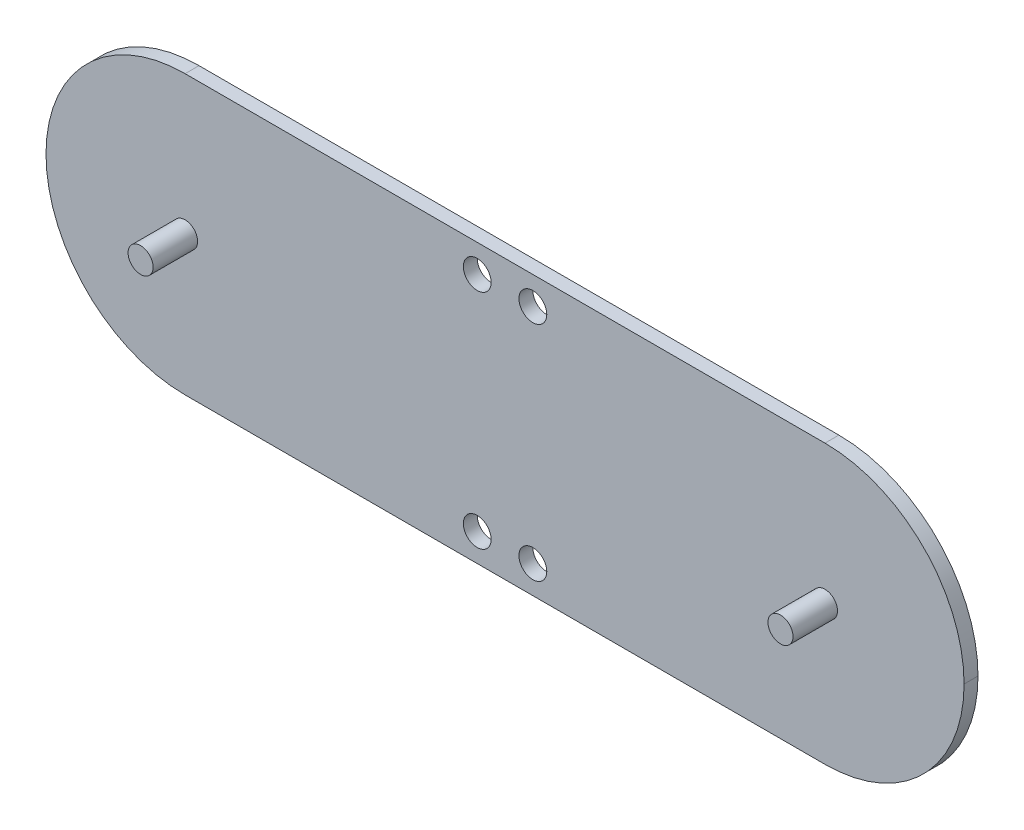
ISO-10303-21;
HEADER;
FILE_DESCRIPTION(('STEP AP214'),'2;1');
FILE_NAME('part.step','',(''),(''),'','','');
FILE_SCHEMA(('AUTOMOTIVE_DESIGN { 1 0 10303 214 1 1 1 1 }'));
ENDSEC;
DATA;
#1=APPLICATION_CONTEXT('core data for automotive mechanical design processes');
#2=APPLICATION_PROTOCOL_DEFINITION('international standard','automotive_design',2000,#1);
#3=PRODUCT_CONTEXT('',#1,'mechanical');
#4=PRODUCT('Part','Part','',(#3));
#5=PRODUCT_RELATED_PRODUCT_CATEGORY('part','',(#4));
#6=PRODUCT_DEFINITION_FORMATION('','',#4);
#7=PRODUCT_DEFINITION_CONTEXT('part definition',#1,'design');
#8=PRODUCT_DEFINITION('design','',#6,#7);
#9=PRODUCT_DEFINITION_SHAPE('','',#8);
#10=(LENGTH_UNIT() NAMED_UNIT(*) SI_UNIT(.MILLI.,.METRE.));
#11=(NAMED_UNIT(*) PLANE_ANGLE_UNIT() SI_UNIT($,.RADIAN.));
#12=(NAMED_UNIT(*) SI_UNIT($,.STERADIAN.) SOLID_ANGLE_UNIT());
#13=UNCERTAINTY_MEASURE_WITH_UNIT(LENGTH_MEASURE(1.E-05),#10,'distance_accuracy_value','');
#14=(GEOMETRIC_REPRESENTATION_CONTEXT(3) GLOBAL_UNCERTAINTY_ASSIGNED_CONTEXT((#13)) GLOBAL_UNIT_ASSIGNED_CONTEXT((#10,
#11,#12)) REPRESENTATION_CONTEXT('',''));
#15=CARTESIAN_POINT('',(0.,0.,0.));
#16=DIRECTION('',(0.,0.,1.));
#17=DIRECTION('',(1.,0.,0.));
#18=AXIS2_PLACEMENT_3D('',#15,#16,#17);
#19=CARTESIAN_POINT('',(82.5,-25.,2.5));
#20=DIRECTION('',(0.,1.,0.));
#21=DIRECTION('',(-1.,0.,0.));
#22=AXIS2_PLACEMENT_3D('',#19,#20,#21);
#23=PLANE('',#22);
#24=DIRECTION('',(1.,0.,0.));
#25=VECTOR('',#24,1.);
#26=CARTESIAN_POINT('',(82.5,-25.,2.5));
#27=LINE('',#26,#25);
#28=CARTESIAN_POINT('',(-57.5,-25.,2.5));
#29=VERTEX_POINT('',#28);
#30=CARTESIAN_POINT('',(57.5,-25.,2.5));
#31=VERTEX_POINT('',#30);
#32=EDGE_CURVE('E117',#29,#31,#27,.T.);
#33=ORIENTED_EDGE('',*,*,#32,.F.);
#34=DIRECTION('',(0.,0.,-1.));
#35=VECTOR('',#34,1.);
#36=CARTESIAN_POINT('',(-57.5,-25.,2.5));
#37=LINE('',#36,#35);
#38=CARTESIAN_POINT('',(-57.5,-25.,0.));
#39=VERTEX_POINT('',#38);
#40=EDGE_CURVE('E101',#29,#39,#37,.T.);
#41=ORIENTED_EDGE('',*,*,#40,.T.);
#42=DIRECTION('',(1.,0.,0.));
#43=VECTOR('',#42,1.);
#44=CARTESIAN_POINT('',(82.5,-25.,0.));
#45=LINE('',#44,#43);
#46=CARTESIAN_POINT('',(57.5,-25.,0.));
#47=VERTEX_POINT('',#46);
#48=EDGE_CURVE('E114',#39,#47,#45,.T.);
#49=ORIENTED_EDGE('',*,*,#48,.T.);
#50=DIRECTION('',(0.,0.,-1.));
#51=VECTOR('',#50,1.);
#52=CARTESIAN_POINT('',(57.5,-25.,2.5));
#53=LINE('',#52,#51);
#54=EDGE_CURVE('E120',#47,#31,#53,.F.);
#55=ORIENTED_EDGE('',*,*,#54,.T.);
#56=EDGE_LOOP('',(#33,#41,#49,#55));
#57=FACE_BOUND('',#56,.T.);
#58=ADVANCED_FACE('F43',(#57),#23,.F.);
#59=CARTESIAN_POINT('',(82.5,25.,2.5));
#60=DIRECTION('',(0.,-1.,0.));
#61=DIRECTION('',(1.,0.,0.));
#62=AXIS2_PLACEMENT_3D('',#59,#60,#61);
#63=PLANE('',#62);
#64=DIRECTION('',(-1.,0.,0.));
#65=VECTOR('',#64,1.);
#66=CARTESIAN_POINT('',(82.5,25.,0.));
#67=LINE('',#66,#65);
#68=CARTESIAN_POINT('',(57.5,25.,0.));
#69=VERTEX_POINT('',#68);
#70=CARTESIAN_POINT('',(-57.5,25.,0.));
#71=VERTEX_POINT('',#70);
#72=EDGE_CURVE('E126',#69,#71,#67,.T.);
#73=ORIENTED_EDGE('',*,*,#72,.T.);
#74=DIRECTION('',(0.,0.,-1.));
#75=VECTOR('',#74,1.);
#76=CARTESIAN_POINT('',(-57.5,25.,2.5));
#77=LINE('',#76,#75);
#78=CARTESIAN_POINT('',(-57.5,25.,2.5));
#79=VERTEX_POINT('',#78);
#80=EDGE_CURVE('E52',#71,#79,#77,.F.);
#81=ORIENTED_EDGE('',*,*,#80,.T.);
#82=DIRECTION('',(-1.,0.,0.));
#83=VECTOR('',#82,1.);
#84=CARTESIAN_POINT('',(82.5,25.,2.5));
#85=LINE('',#84,#83);
#86=CARTESIAN_POINT('',(57.5,25.,2.5));
#87=VERTEX_POINT('',#86);
#88=EDGE_CURVE('E134',#87,#79,#85,.T.);
#89=ORIENTED_EDGE('',*,*,#88,.F.);
#90=DIRECTION('',(0.,0.,-1.));
#91=VECTOR('',#90,1.);
#92=CARTESIAN_POINT('',(57.5,25.,2.5));
#93=LINE('',#92,#91);
#94=EDGE_CURVE('E156',#87,#69,#93,.T.);
#95=ORIENTED_EDGE('',*,*,#94,.T.);
#96=EDGE_LOOP('',(#73,#81,#89,#95));
#97=FACE_BOUND('',#96,.T.);
#98=ADVANCED_FACE('F195',(#97),#63,.F.);
#99=CARTESIAN_POINT('',(0.,0.,2.5));
#100=DIRECTION('',(0.,0.,-1.));
#101=DIRECTION('',(-1.,0.,0.));
#102=AXIS2_PLACEMENT_3D('',#99,#100,#101);
#103=PLANE('',#102);
#104=CARTESIAN_POINT('',(57.5,0.,2.5));
#105=DIRECTION('',(0.,0.,-1.));
#106=DIRECTION('',(-1.,0.,0.));
#107=AXIS2_PLACEMENT_3D('',#104,#105,#106);
#108=CIRCLE('',#107,2.25);
#109=CARTESIAN_POINT('',(55.25,0.,2.5));
#110=VERTEX_POINT('',#109);
#111=EDGE_CURVE('E263',#110,#110,#108,.T.);
#112=ORIENTED_EDGE('',*,*,#111,.T.);
#113=EDGE_LOOP('',(#112));
#114=FACE_BOUND('',#113,.T.);
#115=CARTESIAN_POINT('',(-57.5,0.,2.5));
#116=DIRECTION('',(0.,0.,-1.));
#117=DIRECTION('',(-1.,0.,0.));
#118=AXIS2_PLACEMENT_3D('',#115,#116,#117);
#119=CIRCLE('',#118,2.25);
#120=CARTESIAN_POINT('',(-59.75,0.,2.5));
#121=VERTEX_POINT('',#120);
#122=EDGE_CURVE('E12',#121,#121,#119,.F.);
#123=ORIENTED_EDGE('',*,*,#122,.F.);
#124=EDGE_LOOP('',(#123));
#125=FACE_BOUND('',#124,.T.);
#126=CARTESIAN_POINT('',(-5.,-20.,2.5));
#127=DIRECTION('',(0.,0.,-1.));
#128=DIRECTION('',(1.,0.,0.));
#129=AXIS2_PLACEMENT_3D('',#126,#127,#128);
#130=CIRCLE('',#129,2.5);
#131=CARTESIAN_POINT('',(-2.5,-20.,2.5));
#132=VERTEX_POINT('',#131);
#133=EDGE_CURVE('E275',#132,#132,#130,.T.);
#134=ORIENTED_EDGE('',*,*,#133,.T.);
#135=EDGE_LOOP('',(#134));
#136=FACE_BOUND('',#135,.T.);
#137=CARTESIAN_POINT('',(5.,-20.,2.5));
#138=DIRECTION('',(0.,0.,-1.));
#139=DIRECTION('',(1.,0.,0.));
#140=AXIS2_PLACEMENT_3D('',#137,#138,#139);
#141=CIRCLE('',#140,2.5);
#142=CARTESIAN_POINT('',(7.5,-20.,2.5));
#143=VERTEX_POINT('',#142);
#144=EDGE_CURVE('E176',#143,#143,#141,.T.);
#145=ORIENTED_EDGE('',*,*,#144,.T.);
#146=EDGE_LOOP('',(#145));
#147=FACE_BOUND('',#146,.T.);
#148=CARTESIAN_POINT('',(-5.,20.,2.5));
#149=DIRECTION('',(0.,0.,1.));
#150=DIRECTION('',(1.,0.,0.));
#151=AXIS2_PLACEMENT_3D('',#148,#149,#150);
#152=CIRCLE('',#151,2.5);
#153=CARTESIAN_POINT('',(-2.5,20.,2.5));
#154=VERTEX_POINT('',#153);
#155=EDGE_CURVE('E167',#154,#154,#152,.T.);
#156=ORIENTED_EDGE('',*,*,#155,.F.);
#157=EDGE_LOOP('',(#156));
#158=FACE_BOUND('',#157,.T.);
#159=CARTESIAN_POINT('',(5.,20.,2.5));
#160=DIRECTION('',(0.,0.,1.));
#161=DIRECTION('',(1.,0.,0.));
#162=AXIS2_PLACEMENT_3D('',#159,#160,#161);
#163=CIRCLE('',#162,2.5);
#164=CARTESIAN_POINT('',(7.5,20.,2.5));
#165=VERTEX_POINT('',#164);
#166=EDGE_CURVE('E182',#165,#165,#163,.T.);
#167=ORIENTED_EDGE('',*,*,#166,.F.);
#168=EDGE_LOOP('',(#167));
#169=FACE_BOUND('',#168,.T.);
#170=CARTESIAN_POINT('',(-57.5,0.,2.5));
#171=DIRECTION('',(0.,0.,-1.));
#172=DIRECTION('',(-1.,0.,0.));
#173=AXIS2_PLACEMENT_3D('',#170,#171,#172);
#174=CIRCLE('',#173,25.);
#175=CARTESIAN_POINT('',(-82.5,0.,2.5));
#176=VERTEX_POINT('',#175);
#177=EDGE_CURVE('E150',#79,#176,#174,.F.);
#178=ORIENTED_EDGE('',*,*,#177,.T.);
#179=CARTESIAN_POINT('',(-57.5,0.,2.5));
#180=DIRECTION('',(0.,0.,-1.));
#181=DIRECTION('',(-1.,0.,0.));
#182=AXIS2_PLACEMENT_3D('',#179,#180,#181);
#183=CIRCLE('',#182,25.);
#184=EDGE_CURVE('E153',#176,#29,#183,.F.);
#185=ORIENTED_EDGE('',*,*,#184,.T.);
#186=ORIENTED_EDGE('',*,*,#32,.T.);
#187=CARTESIAN_POINT('',(57.5,0.,2.5));
#188=DIRECTION('',(0.,0.,-1.));
#189=DIRECTION('',(-1.,0.,0.));
#190=AXIS2_PLACEMENT_3D('',#187,#188,#189);
#191=CIRCLE('',#190,25.);
#192=CARTESIAN_POINT('',(82.5,0.,2.5));
#193=VERTEX_POINT('',#192);
#194=EDGE_CURVE('E147',#31,#193,#191,.F.);
#195=ORIENTED_EDGE('',*,*,#194,.T.);
#196=CARTESIAN_POINT('',(57.5,0.,2.5));
#197=DIRECTION('',(0.,0.,-1.));
#198=DIRECTION('',(-1.,0.,0.));
#199=AXIS2_PLACEMENT_3D('',#196,#197,#198);
#200=CIRCLE('',#199,25.);
#201=EDGE_CURVE('E65',#193,#87,#200,.F.);
#202=ORIENTED_EDGE('',*,*,#201,.T.);
#203=ORIENTED_EDGE('',*,*,#88,.T.);
#204=EDGE_LOOP('',(#178,#185,#186,#195,#202,#203));
#205=FACE_BOUND('',#204,.T.);
#206=ADVANCED_FACE('F189',(#114,#125,#136,#147,#158,#169,#205),#103,.F.);
#207=CARTESIAN_POINT('',(0.,0.,0.));
#208=DIRECTION('',(0.,0.,-1.));
#209=DIRECTION('',(-1.,0.,0.));
#210=AXIS2_PLACEMENT_3D('',#207,#208,#209);
#211=PLANE('',#210);
#212=CARTESIAN_POINT('',(-5.,-20.,0.));
#213=DIRECTION('',(0.,0.,-1.));
#214=DIRECTION('',(1.,0.,0.));
#215=AXIS2_PLACEMENT_3D('',#212,#213,#214);
#216=CIRCLE('',#215,2.5);
#217=CARTESIAN_POINT('',(-2.5,-20.,0.));
#218=VERTEX_POINT('',#217);
#219=EDGE_CURVE('E185',#218,#218,#216,.T.);
#220=ORIENTED_EDGE('',*,*,#219,.F.);
#221=EDGE_LOOP('',(#220));
#222=FACE_BOUND('',#221,.T.);
#223=CARTESIAN_POINT('',(5.,-20.,0.));
#224=DIRECTION('',(0.,0.,-1.));
#225=DIRECTION('',(1.,0.,0.));
#226=AXIS2_PLACEMENT_3D('',#223,#224,#225);
#227=CIRCLE('',#226,2.5);
#228=CARTESIAN_POINT('',(7.5,-20.,0.));
#229=VERTEX_POINT('',#228);
#230=EDGE_CURVE('E278',#229,#229,#227,.T.);
#231=ORIENTED_EDGE('',*,*,#230,.F.);
#232=EDGE_LOOP('',(#231));
#233=FACE_BOUND('',#232,.T.);
#234=CARTESIAN_POINT('',(-5.,20.,0.));
#235=DIRECTION('',(0.,0.,1.));
#236=DIRECTION('',(1.,0.,0.));
#237=AXIS2_PLACEMENT_3D('',#234,#235,#236);
#238=CIRCLE('',#237,2.5);
#239=CARTESIAN_POINT('',(-2.5,20.,0.));
#240=VERTEX_POINT('',#239);
#241=EDGE_CURVE('E162',#240,#240,#238,.T.);
#242=ORIENTED_EDGE('',*,*,#241,.T.);
#243=EDGE_LOOP('',(#242));
#244=FACE_BOUND('',#243,.T.);
#245=CARTESIAN_POINT('',(5.,20.,0.));
#246=DIRECTION('',(0.,0.,1.));
#247=DIRECTION('',(1.,0.,0.));
#248=AXIS2_PLACEMENT_3D('',#245,#246,#247);
#249=CIRCLE('',#248,2.5);
#250=CARTESIAN_POINT('',(7.5,20.,0.));
#251=VERTEX_POINT('',#250);
#252=EDGE_CURVE('E173',#251,#251,#249,.T.);
#253=ORIENTED_EDGE('',*,*,#252,.T.);
#254=EDGE_LOOP('',(#253));
#255=FACE_BOUND('',#254,.T.);
#256=ORIENTED_EDGE('',*,*,#48,.F.);
#257=CARTESIAN_POINT('',(-57.5,0.,0.));
#258=DIRECTION('',(0.,0.,-1.));
#259=DIRECTION('',(-1.,0.,0.));
#260=AXIS2_PLACEMENT_3D('',#257,#258,#259);
#261=CIRCLE('',#260,25.);
#262=CARTESIAN_POINT('',(-82.5,0.,0.));
#263=VERTEX_POINT('',#262);
#264=EDGE_CURVE('E97',#39,#263,#261,.T.);
#265=ORIENTED_EDGE('',*,*,#264,.T.);
#266=CARTESIAN_POINT('',(-57.5,0.,0.));
#267=DIRECTION('',(0.,0.,-1.));
#268=DIRECTION('',(-1.,0.,0.));
#269=AXIS2_PLACEMENT_3D('',#266,#267,#268);
#270=CIRCLE('',#269,25.);
#271=EDGE_CURVE('E108',#263,#71,#270,.T.);
#272=ORIENTED_EDGE('',*,*,#271,.T.);
#273=ORIENTED_EDGE('',*,*,#72,.F.);
#274=CARTESIAN_POINT('',(57.5,0.,0.));
#275=DIRECTION('',(0.,0.,-1.));
#276=DIRECTION('',(-1.,0.,0.));
#277=AXIS2_PLACEMENT_3D('',#274,#275,#276);
#278=CIRCLE('',#277,25.);
#279=CARTESIAN_POINT('',(82.5,0.,0.));
#280=VERTEX_POINT('',#279);
#281=EDGE_CURVE('E119',#69,#280,#278,.T.);
#282=ORIENTED_EDGE('',*,*,#281,.T.);
#283=CARTESIAN_POINT('',(57.5,0.,0.));
#284=DIRECTION('',(0.,0.,-1.));
#285=DIRECTION('',(-1.,0.,0.));
#286=AXIS2_PLACEMENT_3D('',#283,#284,#285);
#287=CIRCLE('',#286,25.);
#288=EDGE_CURVE('E124',#280,#47,#287,.T.);
#289=ORIENTED_EDGE('',*,*,#288,.T.);
#290=EDGE_LOOP('',(#256,#265,#272,#273,#282,#289));
#291=FACE_BOUND('',#290,.T.);
#292=ADVANCED_FACE('F122',(#222,#233,#244,#255,#291),#211,.T.);
#293=CARTESIAN_POINT('',(-57.5,0.,2.5));
#294=DIRECTION('',(0.,0.,-1.));
#295=DIRECTION('',(-1.,0.,0.));
#296=AXIS2_PLACEMENT_3D('',#293,#294,#295);
#297=CYLINDRICAL_SURFACE('',#296,25.);
#298=DIRECTION('',(0.,0.,-1.));
#299=VECTOR('',#298,1.);
#300=CARTESIAN_POINT('',(-82.5,0.,2.5));
#301=LINE('',#300,#299);
#302=EDGE_CURVE('E103',#176,#263,#301,.T.);
#303=ORIENTED_EDGE('',*,*,#302,.F.);
#304=ORIENTED_EDGE('',*,*,#177,.F.);
#305=ORIENTED_EDGE('',*,*,#80,.F.);
#306=ORIENTED_EDGE('',*,*,#271,.F.);
#307=EDGE_LOOP('',(#303,#304,#305,#306));
#308=FACE_BOUND('',#307,.T.);
#309=ADVANCED_FACE('F192',(#308),#297,.T.);
#310=CARTESIAN_POINT('',(-57.5,0.,2.5));
#311=DIRECTION('',(0.,0.,-1.));
#312=DIRECTION('',(-1.,0.,0.));
#313=AXIS2_PLACEMENT_3D('',#310,#311,#312);
#314=CYLINDRICAL_SURFACE('',#313,25.);
#315=ORIENTED_EDGE('',*,*,#184,.F.);
#316=ORIENTED_EDGE('',*,*,#302,.T.);
#317=ORIENTED_EDGE('',*,*,#264,.F.);
#318=ORIENTED_EDGE('',*,*,#40,.F.);
#319=EDGE_LOOP('',(#315,#316,#317,#318));
#320=FACE_BOUND('',#319,.T.);
#321=ADVANCED_FACE('F100',(#320),#314,.T.);
#322=CARTESIAN_POINT('',(57.5,0.,2.5));
#323=DIRECTION('',(0.,0.,-1.));
#324=DIRECTION('',(-1.,0.,0.));
#325=AXIS2_PLACEMENT_3D('',#322,#323,#324);
#326=CYLINDRICAL_SURFACE('',#325,25.);
#327=ORIENTED_EDGE('',*,*,#94,.F.);
#328=ORIENTED_EDGE('',*,*,#201,.F.);
#329=DIRECTION('',(0.,0.,-1.));
#330=VECTOR('',#329,1.);
#331=CARTESIAN_POINT('',(82.5,0.,2.5));
#332=LINE('',#331,#330);
#333=EDGE_CURVE('E131',#280,#193,#332,.F.);
#334=ORIENTED_EDGE('',*,*,#333,.F.);
#335=ORIENTED_EDGE('',*,*,#281,.F.);
#336=EDGE_LOOP('',(#327,#328,#334,#335));
#337=FACE_BOUND('',#336,.T.);
#338=ADVANCED_FACE('F45',(#337),#326,.T.);
#339=CARTESIAN_POINT('',(57.5,0.,2.5));
#340=DIRECTION('',(0.,0.,-1.));
#341=DIRECTION('',(-1.,0.,0.));
#342=AXIS2_PLACEMENT_3D('',#339,#340,#341);
#343=CYLINDRICAL_SURFACE('',#342,25.);
#344=ORIENTED_EDGE('',*,*,#194,.F.);
#345=ORIENTED_EDGE('',*,*,#54,.F.);
#346=ORIENTED_EDGE('',*,*,#288,.F.);
#347=ORIENTED_EDGE('',*,*,#333,.T.);
#348=EDGE_LOOP('',(#344,#345,#346,#347));
#349=FACE_BOUND('',#348,.T.);
#350=ADVANCED_FACE('F197',(#349),#343,.T.);
#351=CARTESIAN_POINT('',(5.,20.,0.));
#352=DIRECTION('',(0.,0.,1.));
#353=DIRECTION('',(1.,0.,0.));
#354=AXIS2_PLACEMENT_3D('',#351,#352,#353);
#355=CYLINDRICAL_SURFACE('',#354,2.5);
#356=ORIENTED_EDGE('',*,*,#252,.F.);
#357=EDGE_LOOP('',(#356));
#358=FACE_BOUND('',#357,.T.);
#359=ORIENTED_EDGE('',*,*,#166,.T.);
#360=EDGE_LOOP('',(#359));
#361=FACE_BOUND('',#360,.T.);
#362=ADVANCED_FACE('F199',(#358,#361),#355,.F.);
#363=CARTESIAN_POINT('',(-5.,20.,0.));
#364=DIRECTION('',(0.,0.,1.));
#365=DIRECTION('',(1.,0.,0.));
#366=AXIS2_PLACEMENT_3D('',#363,#364,#365);
#367=CYLINDRICAL_SURFACE('',#366,2.5);
#368=ORIENTED_EDGE('',*,*,#241,.F.);
#369=EDGE_LOOP('',(#368));
#370=FACE_BOUND('',#369,.T.);
#371=ORIENTED_EDGE('',*,*,#155,.T.);
#372=EDGE_LOOP('',(#371));
#373=FACE_BOUND('',#372,.T.);
#374=ADVANCED_FACE('F204',(#370,#373),#367,.F.);
#375=CARTESIAN_POINT('',(5.,-20.,0.));
#376=DIRECTION('',(0.,0.,1.));
#377=DIRECTION('',(1.,0.,0.));
#378=AXIS2_PLACEMENT_3D('',#375,#376,#377);
#379=CYLINDRICAL_SURFACE('',#378,2.5);
#380=ORIENTED_EDGE('',*,*,#230,.T.);
#381=EDGE_LOOP('',(#380));
#382=FACE_BOUND('',#381,.T.);
#383=ORIENTED_EDGE('',*,*,#144,.F.);
#384=EDGE_LOOP('',(#383));
#385=FACE_BOUND('',#384,.T.);
#386=ADVANCED_FACE('F232',(#382,#385),#379,.F.);
#387=CARTESIAN_POINT('',(-5.,-20.,0.));
#388=DIRECTION('',(0.,0.,1.));
#389=DIRECTION('',(1.,0.,0.));
#390=AXIS2_PLACEMENT_3D('',#387,#388,#389);
#391=CYLINDRICAL_SURFACE('',#390,2.5);
#392=ORIENTED_EDGE('',*,*,#219,.T.);
#393=EDGE_LOOP('',(#392));
#394=FACE_BOUND('',#393,.T.);
#395=ORIENTED_EDGE('',*,*,#133,.F.);
#396=EDGE_LOOP('',(#395));
#397=FACE_BOUND('',#396,.T.);
#398=ADVANCED_FACE('F236',(#394,#397),#391,.F.);
#399=CARTESIAN_POINT('',(-57.5,0.,10.5));
#400=DIRECTION('',(0.,0.,-1.));
#401=DIRECTION('',(-1.,0.,0.));
#402=AXIS2_PLACEMENT_3D('',#399,#400,#401);
#403=CYLINDRICAL_SURFACE('',#402,2.25);
#404=CARTESIAN_POINT('',(-57.5,0.,10.5));
#405=DIRECTION('',(0.,0.,1.));
#406=DIRECTION('',(1.,0.,0.));
#407=AXIS2_PLACEMENT_3D('',#404,#405,#406);
#408=CIRCLE('',#407,2.25);
#409=CARTESIAN_POINT('',(-55.25,0.,10.5));
#410=VERTEX_POINT('',#409);
#411=EDGE_CURVE('E262',#410,#410,#408,.T.);
#412=ORIENTED_EDGE('',*,*,#411,.F.);
#413=EDGE_LOOP('',(#412));
#414=FACE_BOUND('',#413,.T.);
#415=ORIENTED_EDGE('',*,*,#122,.T.);
#416=EDGE_LOOP('',(#415));
#417=FACE_BOUND('',#416,.T.);
#418=ADVANCED_FACE('F240',(#414,#417),#403,.T.);
#419=CARTESIAN_POINT('',(0.,0.,10.5));
#420=DIRECTION('',(0.,0.,1.));
#421=DIRECTION('',(1.,0.,0.));
#422=AXIS2_PLACEMENT_3D('',#419,#420,#421);
#423=PLANE('',#422);
#424=ORIENTED_EDGE('',*,*,#411,.T.);
#425=EDGE_LOOP('',(#424));
#426=FACE_BOUND('',#425,.T.);
#427=ADVANCED_FACE('F244',(#426),#423,.T.);
#428=CARTESIAN_POINT('',(57.5,0.,10.5));
#429=DIRECTION('',(0.,0.,-1.));
#430=DIRECTION('',(-1.,0.,0.));
#431=AXIS2_PLACEMENT_3D('',#428,#429,#430);
#432=CYLINDRICAL_SURFACE('',#431,2.25);
#433=CARTESIAN_POINT('',(57.5,0.,10.5));
#434=DIRECTION('',(0.,0.,-1.));
#435=DIRECTION('',(-1.,0.,0.));
#436=AXIS2_PLACEMENT_3D('',#433,#434,#435);
#437=CIRCLE('',#436,2.25);
#438=CARTESIAN_POINT('',(55.25,0.,10.5));
#439=VERTEX_POINT('',#438);
#440=EDGE_CURVE('E260',#439,#439,#437,.T.);
#441=ORIENTED_EDGE('',*,*,#440,.T.);
#442=EDGE_LOOP('',(#441));
#443=FACE_BOUND('',#442,.T.);
#444=ORIENTED_EDGE('',*,*,#111,.F.);
#445=EDGE_LOOP('',(#444));
#446=FACE_BOUND('',#445,.T.);
#447=ADVANCED_FACE('F248',(#443,#446),#432,.T.);
#448=CARTESIAN_POINT('',(0.,0.,10.5));
#449=DIRECTION('',(0.,0.,1.));
#450=DIRECTION('',(-1.,0.,0.));
#451=AXIS2_PLACEMENT_3D('',#448,#449,#450);
#452=PLANE('',#451);
#453=ORIENTED_EDGE('',*,*,#440,.F.);
#454=EDGE_LOOP('',(#453));
#455=FACE_BOUND('',#454,.T.);
#456=ADVANCED_FACE('F252',(#455),#452,.T.);
#457=CLOSED_SHELL('',(#58,#98,#206,#292,#309,#321,#338,#350,#362,#374,#386,#398,#418,#427,#447,#456));
#458=MANIFOLD_SOLID_BREP('B2',#457);
#459=ADVANCED_BREP_SHAPE_REPRESENTATION('',(#18,#458),#14);
#460=SHAPE_DEFINITION_REPRESENTATION(#9,#459);
ENDSEC;
END-ISO-10303-21;
